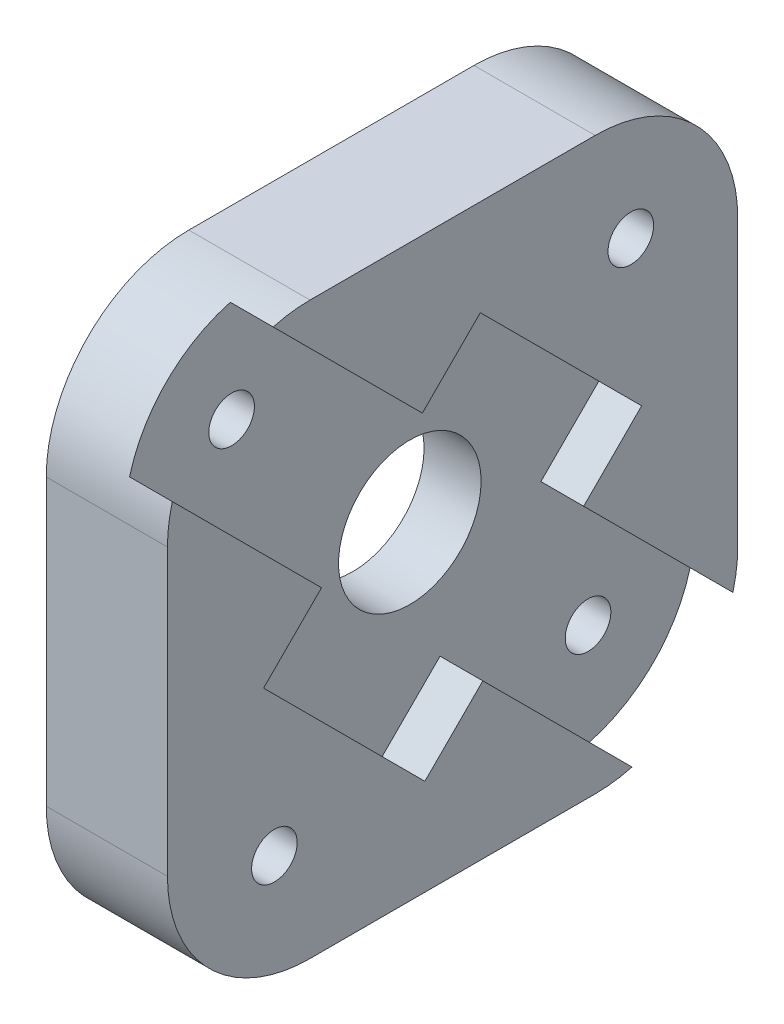
ISO-10303-21;
HEADER;
FILE_DESCRIPTION(('STEP AP214'),'2;1');
FILE_NAME('part.step','',(''),(''),'','','');
FILE_SCHEMA(('AUTOMOTIVE_DESIGN { 1 0 10303 214 1 1 1 1 }'));
ENDSEC;
DATA;
#1=APPLICATION_CONTEXT('core data for automotive mechanical design processes');
#2=APPLICATION_PROTOCOL_DEFINITION('international standard','automotive_design',2000,#1);
#3=PRODUCT_CONTEXT('',#1,'mechanical');
#4=PRODUCT('Part','Part','',(#3));
#5=PRODUCT_RELATED_PRODUCT_CATEGORY('part','',(#4));
#6=PRODUCT_DEFINITION_FORMATION('','',#4);
#7=PRODUCT_DEFINITION_CONTEXT('part definition',#1,'design');
#8=PRODUCT_DEFINITION('design','',#6,#7);
#9=PRODUCT_DEFINITION_SHAPE('','',#8);
#10=(LENGTH_UNIT() NAMED_UNIT(*) SI_UNIT(.MILLI.,.METRE.));
#11=(NAMED_UNIT(*) PLANE_ANGLE_UNIT() SI_UNIT($,.RADIAN.));
#12=(NAMED_UNIT(*) SI_UNIT($,.STERADIAN.) SOLID_ANGLE_UNIT());
#13=UNCERTAINTY_MEASURE_WITH_UNIT(LENGTH_MEASURE(1.E-05),#10,'distance_accuracy_value','');
#14=(GEOMETRIC_REPRESENTATION_CONTEXT(3) GLOBAL_UNCERTAINTY_ASSIGNED_CONTEXT((#13)) GLOBAL_UNIT_ASSIGNED_CONTEXT((#10,
#11,#12)) REPRESENTATION_CONTEXT('',''));
#15=CARTESIAN_POINT('',(0.,0.,0.));
#16=DIRECTION('',(0.,0.,1.));
#17=DIRECTION('',(1.,0.,0.));
#18=AXIS2_PLACEMENT_3D('',#15,#16,#17);
#19=CARTESIAN_POINT('',(0.,0.,0.));
#20=DIRECTION('',(1.,0.,0.));
#21=DIRECTION('',(0.,0.,-1.));
#22=AXIS2_PLACEMENT_3D('',#19,#20,#21);
#23=CYLINDRICAL_SURFACE('',#22,5.);
#24=CARTESIAN_POINT('',(5.5,0.,0.));
#25=DIRECTION('',(1.,0.,0.));
#26=DIRECTION('',(0.,0.,-1.));
#27=AXIS2_PLACEMENT_3D('',#24,#25,#26);
#28=CIRCLE('',#27,5.);
#29=CARTESIAN_POINT('',(5.5,0.,-5.));
#30=VERTEX_POINT('',#29);
#31=EDGE_CURVE('E264',#30,#30,#28,.T.);
#32=ORIENTED_EDGE('',*,*,#31,.T.);
#33=EDGE_LOOP('',(#32));
#34=FACE_BOUND('',#33,.T.);
#35=CARTESIAN_POINT('',(1.5,0.,0.));
#36=DIRECTION('',(-1.,0.,0.));
#37=DIRECTION('',(0.,0.,1.));
#38=AXIS2_PLACEMENT_3D('',#35,#36,#37);
#39=CIRCLE('',#38,5.);
#40=CARTESIAN_POINT('',(1.5,0.,5.));
#41=VERTEX_POINT('',#40);
#42=EDGE_CURVE('E36',#41,#41,#39,.F.);
#43=ORIENTED_EDGE('',*,*,#42,.F.);
#44=EDGE_LOOP('',(#43));
#45=FACE_BOUND('',#44,.T.);
#46=ADVANCED_FACE('F32',(#34,#45),#23,.F.);
#47=CARTESIAN_POINT('',(8.5,0.,0.));
#48=DIRECTION('',(1.,0.,0.));
#49=DIRECTION('',(0.,0.,-1.));
#50=AXIS2_PLACEMENT_3D('',#47,#48,#49);
#51=PLANE('',#50);
#52=DIRECTION('',(0.,-0.707106781186569,-0.707106781186526));
#53=VECTOR('',#52,1.);
#54=CARTESIAN_POINT('',(8.5,-21.2132034355962,-14.1421356237289));
#55=LINE('',#54,#53);
#56=CARTESIAN_POINT('',(8.5,12.5881904510253,19.6592582628906));
#57=VERTEX_POINT('',#56);
#58=CARTESIAN_POINT('',(8.5,2.1213203435594,9.19238815542533));
#59=VERTEX_POINT('',#58);
#60=EDGE_CURVE('E225',#57,#59,#55,.T.);
#61=ORIENTED_EDGE('',*,*,#60,.F.);
#62=CARTESIAN_POINT('',(8.5,9.99999999999999,9.99999999999999));
#63=DIRECTION('',(1.,0.,0.));
#64=DIRECTION('',(0.,0.,-1.));
#65=AXIS2_PLACEMENT_3D('',#62,#63,#64);
#66=CIRCLE('',#65,10.);
#67=CARTESIAN_POINT('',(8.5,9.99999999999999,20.));
#68=VERTEX_POINT('',#67);
#69=EDGE_CURVE('E343',#57,#68,#66,.T.);
#70=ORIENTED_EDGE('',*,*,#69,.T.);
#71=DIRECTION('',(0.,-1.,0.));
#72=VECTOR('',#71,1.);
#73=CARTESIAN_POINT('',(8.5,-20.,20.));
#74=LINE('',#73,#72);
#75=CARTESIAN_POINT('',(8.5,-10.,20.));
#76=VERTEX_POINT('',#75);
#77=EDGE_CURVE('E305',#68,#76,#74,.T.);
#78=ORIENTED_EDGE('',*,*,#77,.T.);
#79=CARTESIAN_POINT('',(8.5,-10.,9.99999999999999));
#80=DIRECTION('',(1.,0.,0.));
#81=DIRECTION('',(0.,0.,-1.));
#82=AXIS2_PLACEMENT_3D('',#79,#80,#81);
#83=CIRCLE('',#82,10.);
#84=CARTESIAN_POINT('',(8.5,-20.,9.99999999999999));
#85=VERTEX_POINT('',#84);
#86=EDGE_CURVE('E201',#76,#85,#83,.T.);
#87=ORIENTED_EDGE('',*,*,#86,.T.);
#88=DIRECTION('',(0.,0.,-1.));
#89=VECTOR('',#88,1.);
#90=CARTESIAN_POINT('',(8.5,-20.,-20.));
#91=LINE('',#90,#89);
#92=CARTESIAN_POINT('',(8.5,-20.,-10.));
#93=VERTEX_POINT('',#92);
#94=EDGE_CURVE('E308',#85,#93,#91,.T.);
#95=ORIENTED_EDGE('',*,*,#94,.T.);
#96=CARTESIAN_POINT('',(8.5,-10.,-10.));
#97=DIRECTION('',(1.,0.,0.));
#98=DIRECTION('',(0.,0.,-1.));
#99=AXIS2_PLACEMENT_3D('',#96,#97,#98);
#100=CIRCLE('',#99,10.);
#101=CARTESIAN_POINT('',(8.5,-19.6592582628911,-12.5881904510238));
#102=VERTEX_POINT('',#101);
#103=EDGE_CURVE('E196',#93,#102,#100,.T.);
#104=ORIENTED_EDGE('',*,*,#103,.T.);
#105=CARTESIAN_POINT('',(8.5,-9.1923881554257,-2.12132034355909));
#106=VERTEX_POINT('',#105);
#107=EDGE_CURVE('E188',#106,#102,#55,.T.);
#108=ORIENTED_EDGE('',*,*,#107,.F.);
#109=DIRECTION('',(0.,0.707106781186551,-0.707106781186544));
#110=VECTOR('',#109,1.);
#111=CARTESIAN_POINT('',(8.5,-13.2582521472478,1.94454364826293));
#112=LINE('',#111,#110);
#113=CARTESIAN_POINT('',(8.5,-13.2582521472478,1.94454364826293));
#114=VERTEX_POINT('',#113);
#115=EDGE_CURVE('E285',#114,#106,#112,.T.);
#116=ORIENTED_EDGE('',*,*,#115,.F.);
#117=DIRECTION('',(0.,-0.707106781186543,-0.707106781186552));
#118=VECTOR('',#117,1.);
#119=CARTESIAN_POINT('',(8.5,-13.2582521472478,1.94454364826293));
#120=LINE('',#119,#118);
#121=CARTESIAN_POINT('',(8.5,-1.94454364826308,13.2582521472478));
#122=VERTEX_POINT('',#121);
#123=EDGE_CURVE('E267',#122,#114,#120,.T.);
#124=ORIENTED_EDGE('',*,*,#123,.F.);
#125=DIRECTION('',(0.,-0.707106781186551,0.707106781186544));
#126=VECTOR('',#125,1.);
#127=CARTESIAN_POINT('',(8.5,-1.94454364826308,13.2582521472478));
#128=LINE('',#127,#126);
#129=EDGE_CURVE('E291',#59,#122,#128,.T.);
#130=ORIENTED_EDGE('',*,*,#129,.F.);
#131=EDGE_LOOP('',(#61,#70,#78,#87,#95,#104,#108,#116,#124,#130));
#132=FACE_BOUND('',#131,.T.);
#133=CARTESIAN_POINT('',(8.5,-12.5,12.5));
#134=DIRECTION('',(1.,0.,0.));
#135=DIRECTION('',(0.,0.,-1.));
#136=AXIS2_PLACEMENT_3D('',#133,#134,#135);
#137=CIRCLE('',#136,1.6);
#138=CARTESIAN_POINT('',(8.5,-12.5,10.9));
#139=VERTEX_POINT('',#138);
#140=EDGE_CURVE('E251',#139,#139,#137,.T.);
#141=ORIENTED_EDGE('',*,*,#140,.F.);
#142=EDGE_LOOP('',(#141));
#143=FACE_BOUND('',#142,.T.);
#144=ADVANCED_FACE('F350',(#132,#143),#51,.T.);
#145=CARTESIAN_POINT('',(5.5,-1.94454364826308,13.2582521472478));
#146=DIRECTION('',(0.,0.707106781186544,0.707106781186551));
#147=DIRECTION('',(0.,-0.707106781186551,0.707106781186544));
#148=AXIS2_PLACEMENT_3D('',#145,#146,#147);
#149=PLANE('',#148);
#150=DIRECTION('',(0.,-0.707106781186551,0.707106781186544));
#151=VECTOR('',#150,1.);
#152=CARTESIAN_POINT('',(5.5,-1.94454364826308,13.2582521472478));
#153=LINE('',#152,#151);
#154=CARTESIAN_POINT('',(5.5,2.1213203435594,9.19238815542533));
#155=VERTEX_POINT('',#154);
#156=CARTESIAN_POINT('',(5.5,-1.94454364826308,13.2582521472478));
#157=VERTEX_POINT('',#156);
#158=EDGE_CURVE('E279',#155,#157,#153,.T.);
#159=ORIENTED_EDGE('',*,*,#158,.F.);
#160=DIRECTION('',(1.,0.,0.));
#161=VECTOR('',#160,1.);
#162=CARTESIAN_POINT('',(5.5,2.1213203435594,9.19238815542533));
#163=LINE('',#162,#161);
#164=EDGE_CURVE('E239',#155,#59,#163,.T.);
#165=ORIENTED_EDGE('',*,*,#164,.T.);
#166=ORIENTED_EDGE('',*,*,#129,.T.);
#167=DIRECTION('',(1.,0.,0.));
#168=VECTOR('',#167,1.);
#169=CARTESIAN_POINT('',(5.5,-1.94454364826308,13.2582521472478));
#170=LINE('',#169,#168);
#171=EDGE_CURVE('E294',#157,#122,#170,.T.);
#172=ORIENTED_EDGE('',*,*,#171,.F.);
#173=EDGE_LOOP('',(#159,#165,#166,#172));
#174=FACE_BOUND('',#173,.T.);
#175=ADVANCED_FACE('F397',(#174),#149,.F.);
#176=CARTESIAN_POINT('',(5.5,-13.2582521472478,1.94454364826293));
#177=DIRECTION('',(0.,-0.707106781186544,-0.707106781186551));
#178=DIRECTION('',(0.,0.707106781186551,-0.707106781186544));
#179=AXIS2_PLACEMENT_3D('',#176,#177,#178);
#180=PLANE('',#179);
#181=ORIENTED_EDGE('',*,*,#115,.T.);
#182=DIRECTION('',(-1.,0.,0.));
#183=VECTOR('',#182,1.);
#184=CARTESIAN_POINT('',(5.5,-9.19238815542571,-2.12132034355909));
#185=LINE('',#184,#183);
#186=CARTESIAN_POINT('',(5.5,-9.1923881554257,-2.12132034355909));
#187=VERTEX_POINT('',#186);
#188=EDGE_CURVE('E176',#106,#187,#185,.T.);
#189=ORIENTED_EDGE('',*,*,#188,.T.);
#190=DIRECTION('',(0.,0.707106781186551,-0.707106781186544));
#191=VECTOR('',#190,1.);
#192=CARTESIAN_POINT('',(5.5,-13.2582521472478,1.94454364826293));
#193=LINE('',#192,#191);
#194=CARTESIAN_POINT('',(5.5,-13.2582521472478,1.94454364826293));
#195=VERTEX_POINT('',#194);
#196=EDGE_CURVE('E273',#195,#187,#193,.T.);
#197=ORIENTED_EDGE('',*,*,#196,.F.);
#198=DIRECTION('',(1.,0.,0.));
#199=VECTOR('',#198,1.);
#200=CARTESIAN_POINT('',(5.5,-13.2582521472478,1.94454364826293));
#201=LINE('',#200,#199);
#202=EDGE_CURVE('E283',#195,#114,#201,.T.);
#203=ORIENTED_EDGE('',*,*,#202,.T.);
#204=EDGE_LOOP('',(#181,#189,#197,#203));
#205=FACE_BOUND('',#204,.T.);
#206=ADVANCED_FACE('F407',(#205),#180,.F.);
#207=CARTESIAN_POINT('',(0.,12.5,12.5));
#208=DIRECTION('',(1.,0.,0.));
#209=DIRECTION('',(0.,0.,-1.));
#210=AXIS2_PLACEMENT_3D('',#207,#208,#209);
#211=CYLINDRICAL_SURFACE('',#210,1.6);
#212=CARTESIAN_POINT('',(0.,12.5,12.5));
#213=DIRECTION('',(1.,0.,0.));
#214=DIRECTION('',(0.,0.,-1.));
#215=AXIS2_PLACEMENT_3D('',#212,#213,#214);
#216=CIRCLE('',#215,1.6);
#217=CARTESIAN_POINT('',(0.,12.5,10.9));
#218=VERTEX_POINT('',#217);
#219=EDGE_CURVE('E250',#218,#218,#216,.T.);
#220=ORIENTED_EDGE('',*,*,#219,.F.);
#221=EDGE_LOOP('',(#220));
#222=FACE_BOUND('',#221,.T.);
#223=CARTESIAN_POINT('',(5.5,12.5,12.5));
#224=DIRECTION('',(1.,0.,0.));
#225=DIRECTION('',(0.,0.,-1.));
#226=AXIS2_PLACEMENT_3D('',#223,#224,#225);
#227=CIRCLE('',#226,1.6);
#228=CARTESIAN_POINT('',(5.5,12.5,10.9));
#229=VERTEX_POINT('',#228);
#230=EDGE_CURVE('E212',#229,#229,#227,.F.);
#231=ORIENTED_EDGE('',*,*,#230,.F.);
#232=EDGE_LOOP('',(#231));
#233=FACE_BOUND('',#232,.T.);
#234=ADVANCED_FACE('F429',(#222,#233),#211,.F.);
#235=CARTESIAN_POINT('',(0.,-12.5,-12.5));
#236=DIRECTION('',(1.,0.,0.));
#237=DIRECTION('',(0.,0.,-1.));
#238=AXIS2_PLACEMENT_3D('',#235,#236,#237);
#239=CYLINDRICAL_SURFACE('',#238,1.6);
#240=CARTESIAN_POINT('',(0.,-12.5,-12.5));
#241=DIRECTION('',(1.,0.,0.));
#242=DIRECTION('',(0.,0.,-1.));
#243=AXIS2_PLACEMENT_3D('',#240,#241,#242);
#244=CIRCLE('',#243,1.6);
#245=CARTESIAN_POINT('',(0.,-12.5,-14.1));
#246=VERTEX_POINT('',#245);
#247=EDGE_CURVE('E254',#246,#246,#244,.T.);
#248=ORIENTED_EDGE('',*,*,#247,.F.);
#249=EDGE_LOOP('',(#248));
#250=FACE_BOUND('',#249,.T.);
#251=CARTESIAN_POINT('',(5.5,-12.5,-12.5));
#252=DIRECTION('',(1.,0.,0.));
#253=DIRECTION('',(0.,0.,-1.));
#254=AXIS2_PLACEMENT_3D('',#251,#252,#253);
#255=CIRCLE('',#254,1.6);
#256=CARTESIAN_POINT('',(5.5,-12.5,-14.1));
#257=VERTEX_POINT('',#256);
#258=EDGE_CURVE('E210',#257,#257,#255,.F.);
#259=ORIENTED_EDGE('',*,*,#258,.F.);
#260=EDGE_LOOP('',(#259));
#261=FACE_BOUND('',#260,.T.);
#262=ADVANCED_FACE('F461',(#250,#261),#239,.F.);
#263=CARTESIAN_POINT('',(8.5,-20.,20.));
#264=DIRECTION('',(0.,0.,-1.));
#265=DIRECTION('',(-1.,0.,0.));
#266=AXIS2_PLACEMENT_3D('',#263,#264,#265);
#267=PLANE('',#266);
#268=DIRECTION('',(0.,-1.,0.));
#269=VECTOR('',#268,1.);
#270=CARTESIAN_POINT('',(0.,-20.,20.));
#271=LINE('',#270,#269);
#272=CARTESIAN_POINT('',(0.,9.99999999999999,20.));
#273=VERTEX_POINT('',#272);
#274=CARTESIAN_POINT('',(0.,-10.,20.));
#275=VERTEX_POINT('',#274);
#276=EDGE_CURVE('E297',#273,#275,#271,.T.);
#277=ORIENTED_EDGE('',*,*,#276,.T.);
#278=DIRECTION('',(-1.,0.,0.));
#279=VECTOR('',#278,1.);
#280=CARTESIAN_POINT('',(8.5,-10.,20.));
#281=LINE('',#280,#279);
#282=EDGE_CURVE('E11',#275,#76,#281,.F.);
#283=ORIENTED_EDGE('',*,*,#282,.T.);
#284=ORIENTED_EDGE('',*,*,#77,.F.);
#285=DIRECTION('',(-1.,0.,0.));
#286=VECTOR('',#285,1.);
#287=CARTESIAN_POINT('',(8.5,9.99999999999999,20.));
#288=LINE('',#287,#286);
#289=EDGE_CURVE('E41',#68,#273,#288,.T.);
#290=ORIENTED_EDGE('',*,*,#289,.T.);
#291=EDGE_LOOP('',(#277,#283,#284,#290));
#292=FACE_BOUND('',#291,.T.);
#293=ADVANCED_FACE('F367',(#292),#267,.F.);
#294=CARTESIAN_POINT('',(8.5,-20.,-20.));
#295=DIRECTION('',(0.,1.,0.));
#296=DIRECTION('',(0.,0.,1.));
#297=AXIS2_PLACEMENT_3D('',#294,#295,#296);
#298=PLANE('',#297);
#299=DIRECTION('',(0.,0.,-1.));
#300=VECTOR('',#299,1.);
#301=CARTESIAN_POINT('',(0.,-20.,-20.));
#302=LINE('',#301,#300);
#303=CARTESIAN_POINT('',(0.,-20.,9.99999999999999));
#304=VERTEX_POINT('',#303);
#305=CARTESIAN_POINT('',(0.,-20.,-10.));
#306=VERTEX_POINT('',#305);
#307=EDGE_CURVE('E320',#304,#306,#302,.T.);
#308=ORIENTED_EDGE('',*,*,#307,.T.);
#309=DIRECTION('',(-1.,0.,0.));
#310=VECTOR('',#309,1.);
#311=CARTESIAN_POINT('',(8.5,-20.,-10.));
#312=LINE('',#311,#310);
#313=EDGE_CURVE('E341',#306,#93,#312,.F.);
#314=ORIENTED_EDGE('',*,*,#313,.T.);
#315=ORIENTED_EDGE('',*,*,#94,.F.);
#316=DIRECTION('',(-1.,0.,0.));
#317=VECTOR('',#316,1.);
#318=CARTESIAN_POINT('',(8.5,-20.,9.99999999999999));
#319=LINE('',#318,#317);
#320=EDGE_CURVE('E338',#85,#304,#319,.T.);
#321=ORIENTED_EDGE('',*,*,#320,.T.);
#322=EDGE_LOOP('',(#308,#314,#315,#321));
#323=FACE_BOUND('',#322,.T.);
#324=ADVANCED_FACE('F358',(#323),#298,.F.);
#325=CARTESIAN_POINT('',(8.5,-20.,-20.));
#326=DIRECTION('',(0.,0.,1.));
#327=DIRECTION('',(1.,0.,0.));
#328=AXIS2_PLACEMENT_3D('',#325,#326,#327);
#329=PLANE('',#328);
#330=DIRECTION('',(0.,1.,0.));
#331=VECTOR('',#330,1.);
#332=CARTESIAN_POINT('',(8.5,-20.,-20.));
#333=LINE('',#332,#331);
#334=CARTESIAN_POINT('',(8.5,-10.,-20.));
#335=VERTEX_POINT('',#334);
#336=CARTESIAN_POINT('',(8.5,9.99999999999999,-20.));
#337=VERTEX_POINT('',#336);
#338=EDGE_CURVE('E312',#335,#337,#333,.T.);
#339=ORIENTED_EDGE('',*,*,#338,.F.);
#340=DIRECTION('',(-1.,0.,0.));
#341=VECTOR('',#340,1.);
#342=CARTESIAN_POINT('',(8.5,-10.,-20.));
#343=LINE('',#342,#341);
#344=CARTESIAN_POINT('',(0.,-10.,-20.));
#345=VERTEX_POINT('',#344);
#346=EDGE_CURVE('E195',#335,#345,#343,.T.);
#347=ORIENTED_EDGE('',*,*,#346,.T.);
#348=DIRECTION('',(0.,1.,0.));
#349=VECTOR('',#348,1.);
#350=CARTESIAN_POINT('',(0.,-20.,-20.));
#351=LINE('',#350,#349);
#352=CARTESIAN_POINT('',(0.,9.99999999999999,-20.));
#353=VERTEX_POINT('',#352);
#354=EDGE_CURVE('E323',#345,#353,#351,.T.);
#355=ORIENTED_EDGE('',*,*,#354,.T.);
#356=DIRECTION('',(-1.,0.,0.));
#357=VECTOR('',#356,1.);
#358=CARTESIAN_POINT('',(8.5,9.99999999999999,-20.));
#359=LINE('',#358,#357);
#360=EDGE_CURVE('E317',#353,#337,#359,.F.);
#361=ORIENTED_EDGE('',*,*,#360,.T.);
#362=EDGE_LOOP('',(#339,#347,#355,#361));
#363=FACE_BOUND('',#362,.T.);
#364=ADVANCED_FACE('F384',(#363),#329,.F.);
#365=CARTESIAN_POINT('',(8.5,20.,-20.));
#366=DIRECTION('',(0.,-1.,0.));
#367=DIRECTION('',(0.,0.,-1.));
#368=AXIS2_PLACEMENT_3D('',#365,#366,#367);
#369=PLANE('',#368);
#370=DIRECTION('',(0.,0.,1.));
#371=VECTOR('',#370,1.);
#372=CARTESIAN_POINT('',(8.5,20.,-20.));
#373=LINE('',#372,#371);
#374=CARTESIAN_POINT('',(8.5,20.,-10.));
#375=VERTEX_POINT('',#374);
#376=CARTESIAN_POINT('',(8.5,20.,9.99999999999999));
#377=VERTEX_POINT('',#376);
#378=EDGE_CURVE('E314',#375,#377,#373,.T.);
#379=ORIENTED_EDGE('',*,*,#378,.F.);
#380=DIRECTION('',(-1.,0.,0.));
#381=VECTOR('',#380,1.);
#382=CARTESIAN_POINT('',(8.5,20.,-10.));
#383=LINE('',#382,#381);
#384=CARTESIAN_POINT('',(0.,20.,-10.));
#385=VERTEX_POINT('',#384);
#386=EDGE_CURVE('E206',#375,#385,#383,.T.);
#387=ORIENTED_EDGE('',*,*,#386,.T.);
#388=DIRECTION('',(0.,0.,1.));
#389=VECTOR('',#388,1.);
#390=CARTESIAN_POINT('',(0.,20.,-20.));
#391=LINE('',#390,#389);
#392=CARTESIAN_POINT('',(0.,20.,9.99999999999999));
#393=VERTEX_POINT('',#392);
#394=EDGE_CURVE('E309',#385,#393,#391,.T.);
#395=ORIENTED_EDGE('',*,*,#394,.T.);
#396=DIRECTION('',(-1.,0.,0.));
#397=VECTOR('',#396,1.);
#398=CARTESIAN_POINT('',(8.5,20.,9.99999999999999));
#399=LINE('',#398,#397);
#400=EDGE_CURVE('E200',#393,#377,#399,.F.);
#401=ORIENTED_EDGE('',*,*,#400,.T.);
#402=EDGE_LOOP('',(#379,#387,#395,#401));
#403=FACE_BOUND('',#402,.T.);
#404=ADVANCED_FACE('F377',(#403),#369,.F.);
#405=DIRECTION('',(0.,0.70710678118657,0.707106781186525));
#406=VECTOR('',#405,1.);
#407=CARTESIAN_POINT('',(8.5,-14.142135623731,-21.2132034355945));
#408=LINE('',#407,#406);
#409=CARTESIAN_POINT('',(8.5,-12.5881904510267,-19.6592582628903));
#410=VERTEX_POINT('',#409);
#411=CARTESIAN_POINT('',(8.5,-2.12132034356022,-9.19238815542451));
#412=VERTEX_POINT('',#411);
#413=EDGE_CURVE('E171',#410,#412,#408,.T.);
#414=ORIENTED_EDGE('',*,*,#413,.F.);
#415=EDGE_CURVE('E184',#410,#335,#100,.T.);
#416=ORIENTED_EDGE('',*,*,#415,.T.);
#417=ORIENTED_EDGE('',*,*,#338,.T.);
#418=CARTESIAN_POINT('',(8.5,9.99999999999999,-10.));
#419=DIRECTION('',(1.,0.,0.));
#420=DIRECTION('',(0.,0.,-1.));
#421=AXIS2_PLACEMENT_3D('',#418,#419,#420);
#422=CIRCLE('',#421,10.);
#423=EDGE_CURVE('E197',#337,#375,#422,.T.);
#424=ORIENTED_EDGE('',*,*,#423,.T.);
#425=ORIENTED_EDGE('',*,*,#378,.T.);
#426=CARTESIAN_POINT('',(8.5,19.6592582628907,12.5881904510251));
#427=VERTEX_POINT('',#426);
#428=EDGE_CURVE('E344',#377,#427,#66,.T.);
#429=ORIENTED_EDGE('',*,*,#428,.T.);
#430=CARTESIAN_POINT('',(8.5,9.1923881554249,2.12132034355989));
#431=VERTEX_POINT('',#430);
#432=EDGE_CURVE('E189',#431,#427,#408,.T.);
#433=ORIENTED_EDGE('',*,*,#432,.F.);
#434=CARTESIAN_POINT('',(8.5,13.2582521472478,-1.94454364826293));
#435=VERTEX_POINT('',#434);
#436=EDGE_CURVE('E272',#435,#431,#128,.T.);
#437=ORIENTED_EDGE('',*,*,#436,.F.);
#438=DIRECTION('',(0.,0.707106781186544,0.707106781186551));
#439=VECTOR('',#438,1.);
#440=CARTESIAN_POINT('',(8.5,1.94454364826307,-13.2582521472478));
#441=LINE('',#440,#439);
#442=CARTESIAN_POINT('',(8.5,1.94454364826307,-13.2582521472478));
#443=VERTEX_POINT('',#442);
#444=EDGE_CURVE('E288',#443,#435,#441,.T.);
#445=ORIENTED_EDGE('',*,*,#444,.F.);
#446=EDGE_CURVE('E187',#412,#443,#112,.T.);
#447=ORIENTED_EDGE('',*,*,#446,.F.);
#448=EDGE_LOOP('',(#414,#416,#417,#424,#425,#429,#433,#437,#445,#447));
#449=FACE_BOUND('',#448,.T.);
#450=CARTESIAN_POINT('',(8.5,12.5,-12.5));
#451=DIRECTION('',(1.,0.,0.));
#452=DIRECTION('',(0.,0.,-1.));
#453=AXIS2_PLACEMENT_3D('',#450,#451,#452);
#454=CIRCLE('',#453,1.6);
#455=CARTESIAN_POINT('',(8.5,12.5,-14.1));
#456=VERTEX_POINT('',#455);
#457=EDGE_CURVE('E246',#456,#456,#454,.T.);
#458=ORIENTED_EDGE('',*,*,#457,.F.);
#459=EDGE_LOOP('',(#458));
#460=FACE_BOUND('',#459,.T.);
#461=ADVANCED_FACE('F181',(#449,#460),#51,.T.);
#462=CARTESIAN_POINT('',(0.,0.,0.));
#463=DIRECTION('',(1.,0.,0.));
#464=DIRECTION('',(0.,0.,-1.));
#465=AXIS2_PLACEMENT_3D('',#462,#463,#464);
#466=PLANE('',#465);
#467=CARTESIAN_POINT('',(0.,0.,0.));
#468=DIRECTION('',(-1.,0.,0.));
#469=DIRECTION('',(0.,0.,1.));
#470=AXIS2_PLACEMENT_3D('',#467,#468,#469);
#471=CIRCLE('',#470,12.5);
#472=CARTESIAN_POINT('',(0.,0.,12.5));
#473=VERTEX_POINT('',#472);
#474=EDGE_CURVE('E568',#473,#473,#471,.T.);
#475=ORIENTED_EDGE('',*,*,#474,.F.);
#476=EDGE_LOOP('',(#475));
#477=FACE_BOUND('',#476,.T.);
#478=CARTESIAN_POINT('',(0.,12.5,-12.5));
#479=DIRECTION('',(1.,0.,0.));
#480=DIRECTION('',(0.,0.,-1.));
#481=AXIS2_PLACEMENT_3D('',#478,#479,#480);
#482=CIRCLE('',#481,1.6);
#483=CARTESIAN_POINT('',(0.,12.5,-14.1));
#484=VERTEX_POINT('',#483);
#485=EDGE_CURVE('E257',#484,#484,#482,.T.);
#486=ORIENTED_EDGE('',*,*,#485,.T.);
#487=EDGE_LOOP('',(#486));
#488=FACE_BOUND('',#487,.T.);
#489=ORIENTED_EDGE('',*,*,#247,.T.);
#490=EDGE_LOOP('',(#489));
#491=FACE_BOUND('',#490,.T.);
#492=CARTESIAN_POINT('',(0.,-12.5,12.5));
#493=DIRECTION('',(1.,0.,0.));
#494=DIRECTION('',(0.,0.,-1.));
#495=AXIS2_PLACEMENT_3D('',#492,#493,#494);
#496=CIRCLE('',#495,1.6);
#497=CARTESIAN_POINT('',(0.,-12.5,10.9));
#498=VERTEX_POINT('',#497);
#499=EDGE_CURVE('E247',#498,#498,#496,.T.);
#500=ORIENTED_EDGE('',*,*,#499,.T.);
#501=EDGE_LOOP('',(#500));
#502=FACE_BOUND('',#501,.T.);
#503=ORIENTED_EDGE('',*,*,#219,.T.);
#504=EDGE_LOOP('',(#503));
#505=FACE_BOUND('',#504,.T.);
#506=ORIENTED_EDGE('',*,*,#354,.F.);
#507=CARTESIAN_POINT('',(0.,-10.,-10.));
#508=DIRECTION('',(1.,0.,0.));
#509=DIRECTION('',(0.,0.,-1.));
#510=AXIS2_PLACEMENT_3D('',#507,#508,#509);
#511=CIRCLE('',#510,10.);
#512=EDGE_CURVE('E336',#345,#306,#511,.F.);
#513=ORIENTED_EDGE('',*,*,#512,.T.);
#514=ORIENTED_EDGE('',*,*,#307,.F.);
#515=CARTESIAN_POINT('',(0.,-10.,9.99999999999999));
#516=DIRECTION('',(1.,0.,0.));
#517=DIRECTION('',(0.,0.,-1.));
#518=AXIS2_PLACEMENT_3D('',#515,#516,#517);
#519=CIRCLE('',#518,10.);
#520=EDGE_CURVE('E332',#304,#275,#519,.F.);
#521=ORIENTED_EDGE('',*,*,#520,.T.);
#522=ORIENTED_EDGE('',*,*,#276,.F.);
#523=CARTESIAN_POINT('',(0.,9.99999999999999,9.99999999999999));
#524=DIRECTION('',(1.,0.,0.));
#525=DIRECTION('',(0.,0.,-1.));
#526=AXIS2_PLACEMENT_3D('',#523,#524,#525);
#527=CIRCLE('',#526,10.);
#528=EDGE_CURVE('E330',#273,#393,#527,.F.);
#529=ORIENTED_EDGE('',*,*,#528,.T.);
#530=ORIENTED_EDGE('',*,*,#394,.F.);
#531=CARTESIAN_POINT('',(0.,9.99999999999999,-10.));
#532=DIRECTION('',(1.,0.,0.));
#533=DIRECTION('',(0.,0.,-1.));
#534=AXIS2_PLACEMENT_3D('',#531,#532,#533);
#535=CIRCLE('',#534,10.);
#536=EDGE_CURVE('E334',#385,#353,#535,.F.);
#537=ORIENTED_EDGE('',*,*,#536,.T.);
#538=EDGE_LOOP('',(#506,#513,#514,#521,#522,#529,#530,#537));
#539=FACE_BOUND('',#538,.T.);
#540=ADVANCED_FACE('F365',(#477,#488,#491,#502,#505,#539),#466,.F.);
#541=CARTESIAN_POINT('',(8.5,-10.,-10.));
#542=DIRECTION('',(-1.,0.,0.));
#543=DIRECTION('',(0.,0.,1.));
#544=AXIS2_PLACEMENT_3D('',#541,#542,#543);
#545=CYLINDRICAL_SURFACE('',#544,10.);
#546=DIRECTION('',(-1.,0.,0.));
#547=VECTOR('',#546,1.);
#548=CARTESIAN_POINT('',(8.5,-19.6592582628911,-12.5881904510238));
#549=LINE('',#548,#547);
#550=CARTESIAN_POINT('',(5.5,-19.6592582628911,-12.5881904510238));
#551=VERTEX_POINT('',#550);
#552=EDGE_CURVE('E244',#102,#551,#549,.T.);
#553=ORIENTED_EDGE('',*,*,#552,.F.);
#554=ORIENTED_EDGE('',*,*,#103,.F.);
#555=ORIENTED_EDGE('',*,*,#313,.F.);
#556=ORIENTED_EDGE('',*,*,#512,.F.);
#557=ORIENTED_EDGE('',*,*,#346,.F.);
#558=ORIENTED_EDGE('',*,*,#415,.F.);
#559=DIRECTION('',(-1.,0.,0.));
#560=VECTOR('',#559,1.);
#561=CARTESIAN_POINT('',(8.5,-12.5881904510267,-19.6592582628903));
#562=LINE('',#561,#560);
#563=CARTESIAN_POINT('',(5.5,-12.5881904510267,-19.6592582628903));
#564=VERTEX_POINT('',#563);
#565=EDGE_CURVE('E168',#564,#410,#562,.F.);
#566=ORIENTED_EDGE('',*,*,#565,.F.);
#567=CARTESIAN_POINT('',(5.5,-10.,-10.));
#568=DIRECTION('',(1.,0.,0.));
#569=DIRECTION('',(0.,0.,-1.));
#570=AXIS2_PLACEMENT_3D('',#567,#568,#569);
#571=CIRCLE('',#570,10.);
#572=EDGE_CURVE('E229',#564,#551,#571,.F.);
#573=ORIENTED_EDGE('',*,*,#572,.T.);
#574=EDGE_LOOP('',(#553,#554,#555,#556,#557,#558,#566,#573));
#575=FACE_BOUND('',#574,.T.);
#576=ADVANCED_FACE('F193',(#575),#545,.T.);
#577=CARTESIAN_POINT('',(8.5,9.99999999999999,-10.));
#578=DIRECTION('',(-1.,0.,0.));
#579=DIRECTION('',(0.,0.,1.));
#580=AXIS2_PLACEMENT_3D('',#577,#578,#579);
#581=CYLINDRICAL_SURFACE('',#580,10.);
#582=ORIENTED_EDGE('',*,*,#423,.F.);
#583=ORIENTED_EDGE('',*,*,#360,.F.);
#584=ORIENTED_EDGE('',*,*,#536,.F.);
#585=ORIENTED_EDGE('',*,*,#386,.F.);
#586=EDGE_LOOP('',(#582,#583,#584,#585));
#587=FACE_BOUND('',#586,.T.);
#588=ADVANCED_FACE('F381',(#587),#581,.T.);
#589=CARTESIAN_POINT('',(8.5,-10.,9.99999999999999));
#590=DIRECTION('',(-1.,0.,0.));
#591=DIRECTION('',(0.,0.,1.));
#592=AXIS2_PLACEMENT_3D('',#589,#590,#591);
#593=CYLINDRICAL_SURFACE('',#592,10.);
#594=ORIENTED_EDGE('',*,*,#86,.F.);
#595=ORIENTED_EDGE('',*,*,#282,.F.);
#596=ORIENTED_EDGE('',*,*,#520,.F.);
#597=ORIENTED_EDGE('',*,*,#320,.F.);
#598=EDGE_LOOP('',(#594,#595,#596,#597));
#599=FACE_BOUND('',#598,.T.);
#600=ADVANCED_FACE('F361',(#599),#593,.T.);
#601=CARTESIAN_POINT('',(8.5,9.99999999999999,9.99999999999999));
#602=DIRECTION('',(-1.,0.,0.));
#603=DIRECTION('',(0.,0.,1.));
#604=AXIS2_PLACEMENT_3D('',#601,#602,#603);
#605=CYLINDRICAL_SURFACE('',#604,10.);
#606=DIRECTION('',(-1.,0.,0.));
#607=VECTOR('',#606,1.);
#608=CARTESIAN_POINT('',(8.5,12.5881904510253,19.6592582628906));
#609=LINE('',#608,#607);
#610=CARTESIAN_POINT('',(5.5,12.5881904510253,19.6592582628906));
#611=VERTEX_POINT('',#610);
#612=EDGE_CURVE('E242',#611,#57,#609,.F.);
#613=ORIENTED_EDGE('',*,*,#612,.F.);
#614=CARTESIAN_POINT('',(5.5,9.99999999999999,9.99999999999999));
#615=DIRECTION('',(1.,0.,0.));
#616=DIRECTION('',(0.,0.,-1.));
#617=AXIS2_PLACEMENT_3D('',#614,#615,#616);
#618=CIRCLE('',#617,10.);
#619=CARTESIAN_POINT('',(5.5,19.6592582628907,12.5881904510251));
#620=VERTEX_POINT('',#619);
#621=EDGE_CURVE('E216',#611,#620,#618,.F.);
#622=ORIENTED_EDGE('',*,*,#621,.T.);
#623=DIRECTION('',(-1.,0.,0.));
#624=VECTOR('',#623,1.);
#625=CARTESIAN_POINT('',(8.5,19.6592582628907,12.588190451025));
#626=LINE('',#625,#624);
#627=EDGE_CURVE('E177',#427,#620,#626,.T.);
#628=ORIENTED_EDGE('',*,*,#627,.F.);
#629=ORIENTED_EDGE('',*,*,#428,.F.);
#630=ORIENTED_EDGE('',*,*,#400,.F.);
#631=ORIENTED_EDGE('',*,*,#528,.F.);
#632=ORIENTED_EDGE('',*,*,#289,.F.);
#633=ORIENTED_EDGE('',*,*,#69,.F.);
#634=EDGE_LOOP('',(#613,#622,#628,#629,#630,#631,#632,#633));
#635=FACE_BOUND('',#634,.T.);
#636=ADVANCED_FACE('F34',(#635),#605,.T.);
#637=CARTESIAN_POINT('',(5.5,-13.2582521472478,1.94454364826293));
#638=DIRECTION('',(0.,-0.707106781186552,0.707106781186543));
#639=DIRECTION('',(0.,-0.707106781186543,-0.707106781186552));
#640=AXIS2_PLACEMENT_3D('',#637,#638,#639);
#641=PLANE('',#640);
#642=ORIENTED_EDGE('',*,*,#123,.T.);
#643=ORIENTED_EDGE('',*,*,#202,.F.);
#644=DIRECTION('',(0.,-0.707106781186543,-0.707106781186552));
#645=VECTOR('',#644,1.);
#646=CARTESIAN_POINT('',(5.5,-13.2582521472478,1.94454364826293));
#647=LINE('',#646,#645);
#648=EDGE_CURVE('E268',#157,#195,#647,.T.);
#649=ORIENTED_EDGE('',*,*,#648,.F.);
#650=ORIENTED_EDGE('',*,*,#171,.T.);
#651=EDGE_LOOP('',(#642,#643,#649,#650));
#652=FACE_BOUND('',#651,.T.);
#653=ADVANCED_FACE('F403',(#652),#641,.F.);
#654=ORIENTED_EDGE('',*,*,#436,.T.);
#655=DIRECTION('',(-1.,0.,0.));
#656=VECTOR('',#655,1.);
#657=CARTESIAN_POINT('',(5.5,9.1923881554249,2.1213203435599));
#658=LINE('',#657,#656);
#659=CARTESIAN_POINT('',(5.5,9.19238815542489,2.12132034355989));
#660=VERTEX_POINT('',#659);
#661=EDGE_CURVE('E233',#431,#660,#658,.T.);
#662=ORIENTED_EDGE('',*,*,#661,.T.);
#663=CARTESIAN_POINT('',(5.5,13.2582521472478,-1.94454364826293));
#664=VERTEX_POINT('',#663);
#665=EDGE_CURVE('E280',#664,#660,#153,.T.);
#666=ORIENTED_EDGE('',*,*,#665,.F.);
#667=DIRECTION('',(1.,0.,0.));
#668=VECTOR('',#667,1.);
#669=CARTESIAN_POINT('',(5.5,13.2582521472478,-1.94454364826293));
#670=LINE('',#669,#668);
#671=EDGE_CURVE('E298',#664,#435,#670,.T.);
#672=ORIENTED_EDGE('',*,*,#671,.T.);
#673=EDGE_LOOP('',(#654,#662,#666,#672));
#674=FACE_BOUND('',#673,.T.);
#675=ADVANCED_FACE('F436',(#674),#149,.F.);
#676=CARTESIAN_POINT('',(5.5,1.94454364826307,-13.2582521472478));
#677=DIRECTION('',(0.,0.707106781186551,-0.707106781186544));
#678=DIRECTION('',(0.,0.707106781186544,0.707106781186551));
#679=AXIS2_PLACEMENT_3D('',#676,#677,#678);
#680=PLANE('',#679);
#681=ORIENTED_EDGE('',*,*,#444,.T.);
#682=ORIENTED_EDGE('',*,*,#671,.F.);
#683=DIRECTION('',(0.,0.707106781186544,0.707106781186551));
#684=VECTOR('',#683,1.);
#685=CARTESIAN_POINT('',(5.5,1.94454364826307,-13.2582521472478));
#686=LINE('',#685,#684);
#687=CARTESIAN_POINT('',(5.5,1.94454364826307,-13.2582521472478));
#688=VERTEX_POINT('',#687);
#689=EDGE_CURVE('E276',#688,#664,#686,.T.);
#690=ORIENTED_EDGE('',*,*,#689,.F.);
#691=DIRECTION('',(1.,0.,0.));
#692=VECTOR('',#691,1.);
#693=CARTESIAN_POINT('',(5.5,1.94454364826307,-13.2582521472478));
#694=LINE('',#693,#692);
#695=EDGE_CURVE('E300',#688,#443,#694,.T.);
#696=ORIENTED_EDGE('',*,*,#695,.T.);
#697=EDGE_LOOP('',(#681,#682,#690,#696));
#698=FACE_BOUND('',#697,.T.);
#699=ADVANCED_FACE('F439',(#698),#680,.F.);
#700=CARTESIAN_POINT('',(5.5,-2.12132034356021,-9.19238815542451));
#701=VERTEX_POINT('',#700);
#702=EDGE_CURVE('E271',#701,#688,#193,.T.);
#703=ORIENTED_EDGE('',*,*,#702,.F.);
#704=DIRECTION('',(1.,0.,0.));
#705=VECTOR('',#704,1.);
#706=CARTESIAN_POINT('',(5.5,-2.12132034356021,-9.19238815542451));
#707=LINE('',#706,#705);
#708=EDGE_CURVE('E231',#701,#412,#707,.T.);
#709=ORIENTED_EDGE('',*,*,#708,.T.);
#710=ORIENTED_EDGE('',*,*,#446,.T.);
#711=ORIENTED_EDGE('',*,*,#695,.F.);
#712=EDGE_LOOP('',(#703,#709,#710,#711));
#713=FACE_BOUND('',#712,.T.);
#714=ADVANCED_FACE('F434',(#713),#180,.F.);
#715=CARTESIAN_POINT('',(5.5,0.,0.));
#716=DIRECTION('',(-1.,0.,0.));
#717=DIRECTION('',(0.,0.,1.));
#718=AXIS2_PLACEMENT_3D('',#715,#716,#717);
#719=PLANE('',#718);
#720=ORIENTED_EDGE('',*,*,#31,.F.);
#721=EDGE_LOOP('',(#720));
#722=FACE_BOUND('',#721,.T.);
#723=ORIENTED_EDGE('',*,*,#665,.T.);
#724=DIRECTION('',(0.,0.70710678118657,0.707106781186525));
#725=VECTOR('',#724,1.);
#726=CARTESIAN_POINT('',(5.5,-14.142135623731,-21.2132034355945));
#727=LINE('',#726,#725);
#728=EDGE_CURVE('E222',#660,#620,#727,.T.);
#729=ORIENTED_EDGE('',*,*,#728,.T.);
#730=ORIENTED_EDGE('',*,*,#621,.F.);
#731=DIRECTION('',(0.,-0.707106781186569,-0.707106781186526));
#732=VECTOR('',#731,1.);
#733=CARTESIAN_POINT('',(5.5,-21.2132034355962,-14.1421356237289));
#734=LINE('',#733,#732);
#735=EDGE_CURVE('E49',#611,#155,#734,.T.);
#736=ORIENTED_EDGE('',*,*,#735,.T.);
#737=ORIENTED_EDGE('',*,*,#158,.T.);
#738=ORIENTED_EDGE('',*,*,#648,.T.);
#739=ORIENTED_EDGE('',*,*,#196,.T.);
#740=EDGE_CURVE('E218',#187,#551,#734,.T.);
#741=ORIENTED_EDGE('',*,*,#740,.T.);
#742=ORIENTED_EDGE('',*,*,#572,.F.);
#743=EDGE_CURVE('E56',#564,#701,#727,.T.);
#744=ORIENTED_EDGE('',*,*,#743,.T.);
#745=ORIENTED_EDGE('',*,*,#702,.T.);
#746=ORIENTED_EDGE('',*,*,#689,.T.);
#747=EDGE_LOOP('',(#723,#729,#730,#736,#737,#738,#739,#741,#742,#744,#745,#746));
#748=FACE_BOUND('',#747,.T.);
#749=ORIENTED_EDGE('',*,*,#258,.T.);
#750=EDGE_LOOP('',(#749));
#751=FACE_BOUND('',#750,.T.);
#752=ORIENTED_EDGE('',*,*,#230,.T.);
#753=EDGE_LOOP('',(#752));
#754=FACE_BOUND('',#753,.T.);
#755=ADVANCED_FACE('F390',(#722,#748,#751,#754),#719,.F.);
#756=CARTESIAN_POINT('',(0.,-12.5,12.5));
#757=DIRECTION('',(1.,0.,0.));
#758=DIRECTION('',(0.,0.,-1.));
#759=AXIS2_PLACEMENT_3D('',#756,#757,#758);
#760=CYLINDRICAL_SURFACE('',#759,1.6);
#761=ORIENTED_EDGE('',*,*,#499,.F.);
#762=EDGE_LOOP('',(#761));
#763=FACE_BOUND('',#762,.T.);
#764=ORIENTED_EDGE('',*,*,#140,.T.);
#765=EDGE_LOOP('',(#764));
#766=FACE_BOUND('',#765,.T.);
#767=ADVANCED_FACE('F433',(#763,#766),#760,.F.);
#768=CARTESIAN_POINT('',(0.,12.5,-12.5));
#769=DIRECTION('',(1.,0.,0.));
#770=DIRECTION('',(0.,0.,-1.));
#771=AXIS2_PLACEMENT_3D('',#768,#769,#770);
#772=CYLINDRICAL_SURFACE('',#771,1.6);
#773=ORIENTED_EDGE('',*,*,#485,.F.);
#774=EDGE_LOOP('',(#773));
#775=FACE_BOUND('',#774,.T.);
#776=ORIENTED_EDGE('',*,*,#457,.T.);
#777=EDGE_LOOP('',(#776));
#778=FACE_BOUND('',#777,.T.);
#779=ADVANCED_FACE('F416',(#775,#778),#772,.F.);
#780=CARTESIAN_POINT('',(5.5,-14.142135623731,-21.2132034355945));
#781=DIRECTION('',(0.,0.707106781186525,-0.70710678118657));
#782=DIRECTION('',(0.,0.70710678118657,0.707106781186525));
#783=AXIS2_PLACEMENT_3D('',#780,#781,#782);
#784=PLANE('',#783);
#785=ORIENTED_EDGE('',*,*,#565,.T.);
#786=ORIENTED_EDGE('',*,*,#413,.T.);
#787=ORIENTED_EDGE('',*,*,#708,.F.);
#788=ORIENTED_EDGE('',*,*,#743,.F.);
#789=EDGE_LOOP('',(#785,#786,#787,#788));
#790=FACE_BOUND('',#789,.T.);
#791=ADVANCED_FACE('F170',(#790),#784,.F.);
#792=CARTESIAN_POINT('',(5.5,-21.2132034355962,-14.1421356237289));
#793=DIRECTION('',(0.,-0.707106781186526,0.707106781186569));
#794=DIRECTION('',(0.,-0.707106781186569,-0.707106781186526));
#795=AXIS2_PLACEMENT_3D('',#792,#793,#794);
#796=PLANE('',#795);
#797=ORIENTED_EDGE('',*,*,#552,.T.);
#798=ORIENTED_EDGE('',*,*,#740,.F.);
#799=ORIENTED_EDGE('',*,*,#188,.F.);
#800=ORIENTED_EDGE('',*,*,#107,.T.);
#801=EDGE_LOOP('',(#797,#798,#799,#800));
#802=FACE_BOUND('',#801,.T.);
#803=ADVANCED_FACE('F409',(#802),#796,.F.);
#804=ORIENTED_EDGE('',*,*,#612,.T.);
#805=ORIENTED_EDGE('',*,*,#60,.T.);
#806=ORIENTED_EDGE('',*,*,#164,.F.);
#807=ORIENTED_EDGE('',*,*,#735,.F.);
#808=EDGE_LOOP('',(#804,#805,#806,#807));
#809=FACE_BOUND('',#808,.T.);
#810=ADVANCED_FACE('F393',(#809),#796,.F.);
#811=ORIENTED_EDGE('',*,*,#627,.T.);
#812=ORIENTED_EDGE('',*,*,#728,.F.);
#813=ORIENTED_EDGE('',*,*,#661,.F.);
#814=ORIENTED_EDGE('',*,*,#432,.T.);
#815=EDGE_LOOP('',(#811,#812,#813,#814));
#816=FACE_BOUND('',#815,.T.);
#817=ADVANCED_FACE('F389',(#816),#784,.F.);
#818=CARTESIAN_POINT('',(1.5,0.,0.));
#819=DIRECTION('',(-1.,0.,0.));
#820=DIRECTION('',(0.,0.,1.));
#821=AXIS2_PLACEMENT_3D('',#818,#819,#820);
#822=PLANE('',#821);
#823=CARTESIAN_POINT('',(1.5,0.,0.));
#824=DIRECTION('',(-1.,0.,0.));
#825=DIRECTION('',(0.,0.,1.));
#826=AXIS2_PLACEMENT_3D('',#823,#824,#825);
#827=CIRCLE('',#826,12.5);
#828=CARTESIAN_POINT('',(1.5,0.,12.5));
#829=VERTEX_POINT('',#828);
#830=EDGE_CURVE('E565',#829,#829,#827,.T.);
#831=ORIENTED_EDGE('',*,*,#830,.T.);
#832=EDGE_LOOP('',(#831));
#833=FACE_BOUND('',#832,.T.);
#834=ORIENTED_EDGE('',*,*,#42,.T.);
#835=EDGE_LOOP('',(#834));
#836=FACE_BOUND('',#835,.T.);
#837=ADVANCED_FACE('F528',(#833,#836),#822,.T.);
#838=CARTESIAN_POINT('',(1.5,0.,0.));
#839=DIRECTION('',(-1.,0.,0.));
#840=DIRECTION('',(0.,0.,1.));
#841=AXIS2_PLACEMENT_3D('',#838,#839,#840);
#842=CYLINDRICAL_SURFACE('',#841,12.5);
#843=ORIENTED_EDGE('',*,*,#830,.F.);
#844=EDGE_LOOP('',(#843));
#845=FACE_BOUND('',#844,.T.);
#846=ORIENTED_EDGE('',*,*,#474,.T.);
#847=EDGE_LOOP('',(#846));
#848=FACE_BOUND('',#847,.T.);
#849=ADVANCED_FACE('F549',(#845,#848),#842,.F.);
#850=CLOSED_SHELL('',(#46,#144,#175,#206,#234,#262,#293,#324,#364,#404,#461,#540,#576,#588,#600,
#636,#653,#675,#699,#714,#755,#767,#779,#791,#803,#810,#817,#837,#849));
#851=MANIFOLD_SOLID_BREP('B2',#850);
#852=ADVANCED_BREP_SHAPE_REPRESENTATION('',(#18,#851),#14);
#853=SHAPE_DEFINITION_REPRESENTATION(#9,#852);
ENDSEC;
END-ISO-10303-21;
